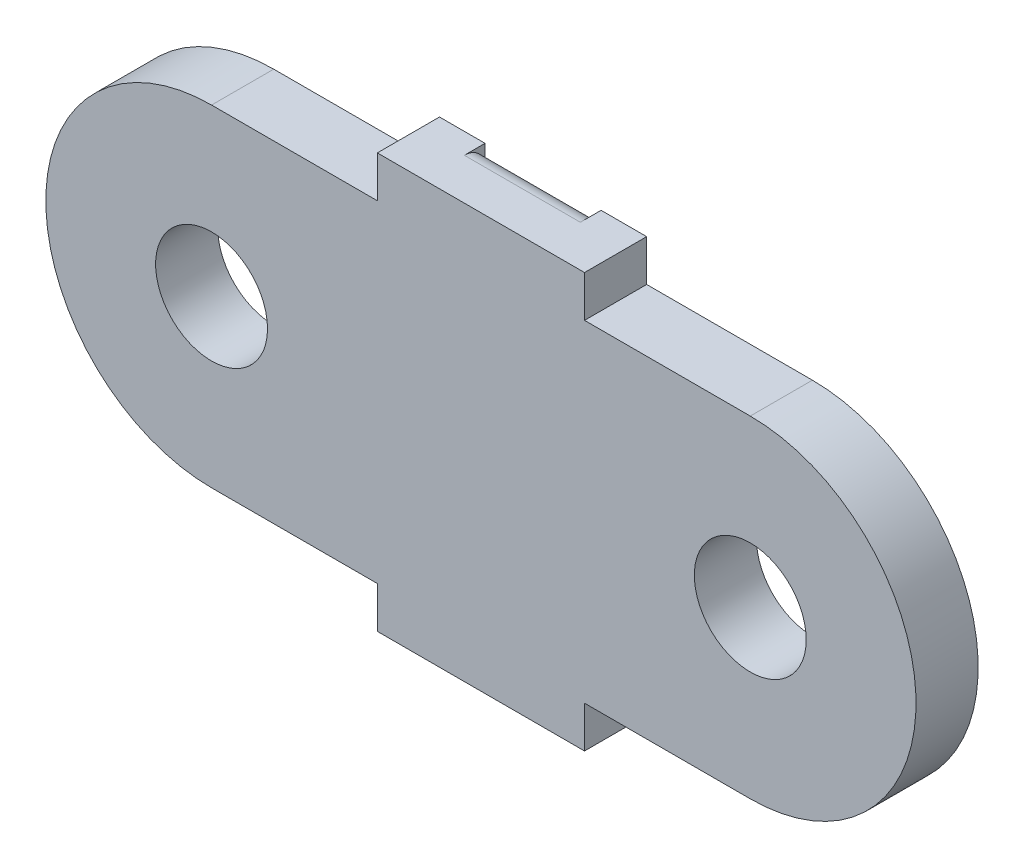
ISO-10303-21;
HEADER;
FILE_DESCRIPTION(('STEP AP214'),'2;1');
FILE_NAME('part.step','',(''),(''),'','','');
FILE_SCHEMA(('AUTOMOTIVE_DESIGN { 1 0 10303 214 1 1 1 1 }'));
ENDSEC;
DATA;
#1=APPLICATION_CONTEXT('core data for automotive mechanical design processes');
#2=APPLICATION_PROTOCOL_DEFINITION('international standard','automotive_design',2000,#1);
#3=PRODUCT_CONTEXT('',#1,'mechanical');
#4=PRODUCT('Part','Part','',(#3));
#5=PRODUCT_RELATED_PRODUCT_CATEGORY('part','',(#4));
#6=PRODUCT_DEFINITION_FORMATION('','',#4);
#7=PRODUCT_DEFINITION_CONTEXT('part definition',#1,'design');
#8=PRODUCT_DEFINITION('design','',#6,#7);
#9=PRODUCT_DEFINITION_SHAPE('','',#8);
#10=(LENGTH_UNIT() NAMED_UNIT(*) SI_UNIT(.MILLI.,.METRE.));
#11=(NAMED_UNIT(*) PLANE_ANGLE_UNIT() SI_UNIT($,.RADIAN.));
#12=(NAMED_UNIT(*) SI_UNIT($,.STERADIAN.) SOLID_ANGLE_UNIT());
#13=UNCERTAINTY_MEASURE_WITH_UNIT(LENGTH_MEASURE(1.E-05),#10,'distance_accuracy_value','');
#14=(GEOMETRIC_REPRESENTATION_CONTEXT(3) GLOBAL_UNCERTAINTY_ASSIGNED_CONTEXT((#13)) GLOBAL_UNIT_ASSIGNED_CONTEXT((#10,
#11,#12)) REPRESENTATION_CONTEXT('',''));
#15=CARTESIAN_POINT('',(0.,0.,0.));
#16=DIRECTION('',(0.,0.,1.));
#17=DIRECTION('',(1.,0.,0.));
#18=AXIS2_PLACEMENT_3D('',#15,#16,#17);
#19=CARTESIAN_POINT('',(-6.5,0.,0.));
#20=DIRECTION('',(0.,0.,-1.));
#21=DIRECTION('',(-1.,0.,0.));
#22=AXIS2_PLACEMENT_3D('',#19,#20,#21);
#23=CYLINDRICAL_SURFACE('',#22,4.);
#24=DIRECTION('',(0.,0.,-1.));
#25=VECTOR('',#24,1.);
#26=CARTESIAN_POINT('',(-6.5,4.,1.5));
#27=LINE('',#26,#25);
#28=CARTESIAN_POINT('',(-6.5,4.,0.));
#29=VERTEX_POINT('',#28);
#30=CARTESIAN_POINT('',(-6.5,4.,1.5));
#31=VERTEX_POINT('',#30);
#32=EDGE_CURVE('E258',#29,#31,#27,.F.);
#33=ORIENTED_EDGE('',*,*,#32,.F.);
#34=CARTESIAN_POINT('',(-6.5,0.,0.));
#35=DIRECTION('',(0.,0.,1.));
#36=DIRECTION('',(1.,0.,0.));
#37=AXIS2_PLACEMENT_3D('',#34,#35,#36);
#38=CIRCLE('',#37,4.);
#39=CARTESIAN_POINT('',(-6.5,-4.,0.));
#40=VERTEX_POINT('',#39);
#41=EDGE_CURVE('E264',#40,#29,#38,.F.);
#42=ORIENTED_EDGE('',*,*,#41,.F.);
#43=DIRECTION('',(0.,0.,1.));
#44=VECTOR('',#43,1.);
#45=CARTESIAN_POINT('',(-6.5,-4.,0.));
#46=LINE('',#45,#44);
#47=CARTESIAN_POINT('',(-6.5,-4.,1.5));
#48=VERTEX_POINT('',#47);
#49=EDGE_CURVE('E261',#48,#40,#46,.F.);
#50=ORIENTED_EDGE('',*,*,#49,.F.);
#51=CARTESIAN_POINT('',(-6.5,0.,1.5));
#52=DIRECTION('',(0.,0.,1.));
#53=DIRECTION('',(1.,0.,0.));
#54=AXIS2_PLACEMENT_3D('',#51,#52,#53);
#55=CIRCLE('',#54,4.);
#56=EDGE_CURVE('E266',#31,#48,#55,.T.);
#57=ORIENTED_EDGE('',*,*,#56,.F.);
#58=EDGE_LOOP('',(#33,#42,#50,#57));
#59=FACE_BOUND('',#58,.T.);
#60=ADVANCED_FACE('F39',(#59),#23,.T.);
#61=CARTESIAN_POINT('',(6.5,0.,1.5));
#62=DIRECTION('',(0.,0.,-1.));
#63=DIRECTION('',(-1.,0.,0.));
#64=AXIS2_PLACEMENT_3D('',#61,#62,#63);
#65=CYLINDRICAL_SURFACE('',#64,4.);
#66=DIRECTION('',(0.,0.,-1.));
#67=VECTOR('',#66,1.);
#68=CARTESIAN_POINT('',(6.5,4.,1.5));
#69=LINE('',#68,#67);
#70=CARTESIAN_POINT('',(6.5,4.,1.5));
#71=VERTEX_POINT('',#70);
#72=CARTESIAN_POINT('',(6.5,4.,0.));
#73=VERTEX_POINT('',#72);
#74=EDGE_CURVE('E174',#71,#73,#69,.T.);
#75=ORIENTED_EDGE('',*,*,#74,.F.);
#76=CARTESIAN_POINT('',(6.5,0.,1.5));
#77=DIRECTION('',(0.,0.,1.));
#78=DIRECTION('',(1.,0.,0.));
#79=AXIS2_PLACEMENT_3D('',#76,#77,#78);
#80=CIRCLE('',#79,4.);
#81=CARTESIAN_POINT('',(6.5,-4.,1.5));
#82=VERTEX_POINT('',#81);
#83=EDGE_CURVE('E185',#82,#71,#80,.T.);
#84=ORIENTED_EDGE('',*,*,#83,.F.);
#85=DIRECTION('',(0.,0.,1.));
#86=VECTOR('',#85,1.);
#87=CARTESIAN_POINT('',(6.5,-4.,1.5));
#88=LINE('',#87,#86);
#89=CARTESIAN_POINT('',(6.5,-4.,0.));
#90=VERTEX_POINT('',#89);
#91=EDGE_CURVE('E252',#90,#82,#88,.T.);
#92=ORIENTED_EDGE('',*,*,#91,.F.);
#93=CARTESIAN_POINT('',(6.5,0.,0.));
#94=DIRECTION('',(0.,0.,1.));
#95=DIRECTION('',(1.,0.,0.));
#96=AXIS2_PLACEMENT_3D('',#93,#94,#95);
#97=CIRCLE('',#96,4.);
#98=EDGE_CURVE('E256',#73,#90,#97,.F.);
#99=ORIENTED_EDGE('',*,*,#98,.F.);
#100=EDGE_LOOP('',(#75,#84,#92,#99));
#101=FACE_BOUND('',#100,.T.);
#102=ADVANCED_FACE('F333',(#101),#65,.T.);
#103=CARTESIAN_POINT('',(0.,4.,1.5));
#104=DIRECTION('',(0.,1.,0.));
#105=DIRECTION('',(0.,0.,1.));
#106=AXIS2_PLACEMENT_3D('',#103,#104,#105);
#107=PLANE('',#106);
#108=DIRECTION('',(1.,0.,0.));
#109=VECTOR('',#108,1.);
#110=CARTESIAN_POINT('',(0.,4.,1.5));
#111=LINE('',#110,#109);
#112=CARTESIAN_POINT('',(2.5,4.,1.5));
#113=VERTEX_POINT('',#112);
#114=EDGE_CURVE('E167',#113,#71,#111,.T.);
#115=ORIENTED_EDGE('',*,*,#114,.T.);
#116=ORIENTED_EDGE('',*,*,#74,.T.);
#117=DIRECTION('',(1.,0.,0.));
#118=VECTOR('',#117,1.);
#119=CARTESIAN_POINT('',(0.,4.,0.));
#120=LINE('',#119,#118);
#121=CARTESIAN_POINT('',(2.5,4.,0.));
#122=VERTEX_POINT('',#121);
#123=EDGE_CURVE('E169',#122,#73,#120,.T.);
#124=ORIENTED_EDGE('',*,*,#123,.F.);
#125=DIRECTION('',(0.,0.,-1.));
#126=VECTOR('',#125,1.);
#127=CARTESIAN_POINT('',(2.5,4.,1.5));
#128=LINE('',#127,#126);
#129=EDGE_CURVE('E163',#113,#122,#128,.T.);
#130=ORIENTED_EDGE('',*,*,#129,.F.);
#131=EDGE_LOOP('',(#115,#116,#124,#130));
#132=FACE_BOUND('',#131,.T.);
#133=ADVANCED_FACE('F165',(#132),#107,.T.);
#134=CARTESIAN_POINT('',(2.5,0.,1.5));
#135=DIRECTION('',(1.,0.,0.));
#136=DIRECTION('',(0.,1.,0.));
#137=AXIS2_PLACEMENT_3D('',#134,#135,#136);
#138=PLANE('',#137);
#139=DIRECTION('',(0.,-1.,0.));
#140=VECTOR('',#139,1.);
#141=CARTESIAN_POINT('',(2.5,0.,0.));
#142=LINE('',#141,#140);
#143=CARTESIAN_POINT('',(2.5,5.,0.));
#144=VERTEX_POINT('',#143);
#145=EDGE_CURVE('E214',#144,#122,#142,.T.);
#146=ORIENTED_EDGE('',*,*,#145,.F.);
#147=DIRECTION('',(0.,0.,-1.));
#148=VECTOR('',#147,1.);
#149=CARTESIAN_POINT('',(2.5,5.,1.5));
#150=LINE('',#149,#148);
#151=CARTESIAN_POINT('',(2.5,5.,1.5));
#152=VERTEX_POINT('',#151);
#153=EDGE_CURVE('E175',#152,#144,#150,.T.);
#154=ORIENTED_EDGE('',*,*,#153,.F.);
#155=DIRECTION('',(0.,-1.,0.));
#156=VECTOR('',#155,1.);
#157=CARTESIAN_POINT('',(2.5,0.,1.5));
#158=LINE('',#157,#156);
#159=EDGE_CURVE('E182',#152,#113,#158,.T.);
#160=ORIENTED_EDGE('',*,*,#159,.T.);
#161=ORIENTED_EDGE('',*,*,#129,.T.);
#162=EDGE_LOOP('',(#146,#154,#160,#161));
#163=FACE_BOUND('',#162,.T.);
#164=ADVANCED_FACE('F189',(#163),#138,.T.);
#165=CARTESIAN_POINT('',(0.,5.,1.5));
#166=DIRECTION('',(0.,1.,0.));
#167=DIRECTION('',(0.,0.,1.));
#168=AXIS2_PLACEMENT_3D('',#165,#166,#167);
#169=PLANE('',#168);
#170=DIRECTION('',(1.,0.,0.));
#171=VECTOR('',#170,1.);
#172=CARTESIAN_POINT('',(0.,5.,0.));
#173=LINE('',#172,#171);
#174=CARTESIAN_POINT('',(1.4,5.,0.));
#175=VERTEX_POINT('',#174);
#176=EDGE_CURVE('E217',#175,#144,#173,.T.);
#177=ORIENTED_EDGE('',*,*,#176,.F.);
#178=DIRECTION('',(0.,0.,1.));
#179=VECTOR('',#178,1.);
#180=CARTESIAN_POINT('',(1.4,5.,1.5));
#181=LINE('',#180,#179);
#182=CARTESIAN_POINT('',(1.4,5.,0.5));
#183=VERTEX_POINT('',#182);
#184=EDGE_CURVE('E11',#175,#183,#181,.T.);
#185=ORIENTED_EDGE('',*,*,#184,.T.);
#186=DIRECTION('',(1.,0.,0.));
#187=VECTOR('',#186,1.);
#188=CARTESIAN_POINT('',(-2.5,5.,0.5));
#189=LINE('',#188,#187);
#190=CARTESIAN_POINT('',(-1.4,5.,0.5));
#191=VERTEX_POINT('',#190);
#192=EDGE_CURVE('E48',#183,#191,#189,.F.);
#193=ORIENTED_EDGE('',*,*,#192,.T.);
#194=DIRECTION('',(0.,0.,-1.));
#195=VECTOR('',#194,1.);
#196=CARTESIAN_POINT('',(-1.4,5.,1.5));
#197=LINE('',#196,#195);
#198=CARTESIAN_POINT('',(-1.4,5.,0.));
#199=VERTEX_POINT('',#198);
#200=EDGE_CURVE('E288',#191,#199,#197,.T.);
#201=ORIENTED_EDGE('',*,*,#200,.T.);
#202=CARTESIAN_POINT('',(-2.5,5.,0.));
#203=VERTEX_POINT('',#202);
#204=EDGE_CURVE('E219',#203,#199,#173,.T.);
#205=ORIENTED_EDGE('',*,*,#204,.F.);
#206=DIRECTION('',(0.,0.,-1.));
#207=VECTOR('',#206,1.);
#208=CARTESIAN_POINT('',(-2.5,5.,1.5));
#209=LINE('',#208,#207);
#210=CARTESIAN_POINT('',(-2.5,5.,1.5));
#211=VERTEX_POINT('',#210);
#212=EDGE_CURVE('E248',#211,#203,#209,.T.);
#213=ORIENTED_EDGE('',*,*,#212,.F.);
#214=DIRECTION('',(1.,0.,0.));
#215=VECTOR('',#214,1.);
#216=CARTESIAN_POINT('',(0.,5.,1.5));
#217=LINE('',#216,#215);
#218=EDGE_CURVE('E191',#211,#152,#217,.T.);
#219=ORIENTED_EDGE('',*,*,#218,.T.);
#220=ORIENTED_EDGE('',*,*,#153,.T.);
#221=EDGE_LOOP('',(#177,#185,#193,#201,#205,#213,#219,#220));
#222=FACE_BOUND('',#221,.T.);
#223=ADVANCED_FACE('F370',(#222),#169,.T.);
#224=CARTESIAN_POINT('',(-2.5,0.,1.5));
#225=DIRECTION('',(1.,0.,0.));
#226=DIRECTION('',(0.,1.,0.));
#227=AXIS2_PLACEMENT_3D('',#224,#225,#226);
#228=PLANE('',#227);
#229=DIRECTION('',(0.,-1.,0.));
#230=VECTOR('',#229,1.);
#231=CARTESIAN_POINT('',(-2.5,0.,0.));
#232=LINE('',#231,#230);
#233=CARTESIAN_POINT('',(-2.5,4.,0.));
#234=VERTEX_POINT('',#233);
#235=EDGE_CURVE('E222',#203,#234,#232,.T.);
#236=ORIENTED_EDGE('',*,*,#235,.T.);
#237=DIRECTION('',(0.,0.,-1.));
#238=VECTOR('',#237,1.);
#239=CARTESIAN_POINT('',(-2.5,4.,1.5));
#240=LINE('',#239,#238);
#241=CARTESIAN_POINT('',(-2.5,4.,1.5));
#242=VERTEX_POINT('',#241);
#243=EDGE_CURVE('E245',#242,#234,#240,.T.);
#244=ORIENTED_EDGE('',*,*,#243,.F.);
#245=DIRECTION('',(0.,-1.,0.));
#246=VECTOR('',#245,1.);
#247=CARTESIAN_POINT('',(-2.5,0.,1.5));
#248=LINE('',#247,#246);
#249=EDGE_CURVE('E194',#211,#242,#248,.T.);
#250=ORIENTED_EDGE('',*,*,#249,.F.);
#251=ORIENTED_EDGE('',*,*,#212,.T.);
#252=EDGE_LOOP('',(#236,#244,#250,#251));
#253=FACE_BOUND('',#252,.T.);
#254=ADVANCED_FACE('F375',(#253),#228,.F.);
#255=CARTESIAN_POINT('',(0.,4.,1.5));
#256=DIRECTION('',(0.,-1.,0.));
#257=DIRECTION('',(0.,0.,-1.));
#258=AXIS2_PLACEMENT_3D('',#255,#256,#257);
#259=PLANE('',#258);
#260=DIRECTION('',(-1.,0.,0.));
#261=VECTOR('',#260,1.);
#262=CARTESIAN_POINT('',(0.,4.,0.));
#263=LINE('',#262,#261);
#264=EDGE_CURVE('E224',#234,#29,#263,.T.);
#265=ORIENTED_EDGE('',*,*,#264,.T.);
#266=ORIENTED_EDGE('',*,*,#32,.T.);
#267=DIRECTION('',(-1.,0.,0.));
#268=VECTOR('',#267,1.);
#269=CARTESIAN_POINT('',(0.,4.,1.5));
#270=LINE('',#269,#268);
#271=EDGE_CURVE('E380',#242,#31,#270,.T.);
#272=ORIENTED_EDGE('',*,*,#271,.F.);
#273=ORIENTED_EDGE('',*,*,#243,.T.);
#274=EDGE_LOOP('',(#265,#266,#272,#273));
#275=FACE_BOUND('',#274,.T.);
#276=ADVANCED_FACE('F379',(#275),#259,.F.);
#277=CARTESIAN_POINT('',(0.,-4.,1.5));
#278=DIRECTION('',(0.,-1.,0.));
#279=DIRECTION('',(0.,0.,-1.));
#280=AXIS2_PLACEMENT_3D('',#277,#278,#279);
#281=PLANE('',#280);
#282=DIRECTION('',(-1.,0.,0.));
#283=VECTOR('',#282,1.);
#284=CARTESIAN_POINT('',(0.,-4.,1.5));
#285=LINE('',#284,#283);
#286=CARTESIAN_POINT('',(-2.5,-4.,1.5));
#287=VERTEX_POINT('',#286);
#288=EDGE_CURVE('E208',#287,#48,#285,.T.);
#289=ORIENTED_EDGE('',*,*,#288,.T.);
#290=ORIENTED_EDGE('',*,*,#49,.T.);
#291=DIRECTION('',(-1.,0.,0.));
#292=VECTOR('',#291,1.);
#293=CARTESIAN_POINT('',(0.,-4.,0.));
#294=LINE('',#293,#292);
#295=CARTESIAN_POINT('',(-2.5,-4.,0.));
#296=VERTEX_POINT('',#295);
#297=EDGE_CURVE('E228',#296,#40,#294,.T.);
#298=ORIENTED_EDGE('',*,*,#297,.F.);
#299=DIRECTION('',(0.,0.,-1.));
#300=VECTOR('',#299,1.);
#301=CARTESIAN_POINT('',(-2.5,-4.,1.5));
#302=LINE('',#301,#300);
#303=EDGE_CURVE('E243',#287,#296,#302,.T.);
#304=ORIENTED_EDGE('',*,*,#303,.F.);
#305=EDGE_LOOP('',(#289,#290,#298,#304));
#306=FACE_BOUND('',#305,.T.);
#307=ADVANCED_FACE('F408',(#306),#281,.T.);
#308=CARTESIAN_POINT('',(-2.5,-5.,0.));
#309=VERTEX_POINT('',#308);
#310=EDGE_CURVE('E225',#296,#309,#232,.T.);
#311=ORIENTED_EDGE('',*,*,#310,.T.);
#312=DIRECTION('',(0.,0.,-1.));
#313=VECTOR('',#312,1.);
#314=CARTESIAN_POINT('',(-2.5,-5.,1.5));
#315=LINE('',#314,#313);
#316=CARTESIAN_POINT('',(-2.5,-5.,1.5));
#317=VERTEX_POINT('',#316);
#318=EDGE_CURVE('E240',#317,#309,#315,.T.);
#319=ORIENTED_EDGE('',*,*,#318,.F.);
#320=EDGE_CURVE('E204',#287,#317,#248,.T.);
#321=ORIENTED_EDGE('',*,*,#320,.F.);
#322=ORIENTED_EDGE('',*,*,#303,.T.);
#323=EDGE_LOOP('',(#311,#319,#321,#322));
#324=FACE_BOUND('',#323,.T.);
#325=ADVANCED_FACE('F321',(#324),#228,.F.);
#326=CARTESIAN_POINT('',(0.,-5.,1.5));
#327=DIRECTION('',(0.,1.,0.));
#328=DIRECTION('',(0.,0.,1.));
#329=AXIS2_PLACEMENT_3D('',#326,#327,#328);
#330=PLANE('',#329);
#331=DIRECTION('',(1.,0.,0.));
#332=VECTOR('',#331,1.);
#333=CARTESIAN_POINT('',(0.,-5.,0.));
#334=LINE('',#333,#332);
#335=CARTESIAN_POINT('',(-1.4,-5.,0.));
#336=VERTEX_POINT('',#335);
#337=EDGE_CURVE('E231',#309,#336,#334,.T.);
#338=ORIENTED_EDGE('',*,*,#337,.T.);
#339=DIRECTION('',(0.,0.,1.));
#340=VECTOR('',#339,1.);
#341=CARTESIAN_POINT('',(-1.4,-5.,0.5));
#342=LINE('',#341,#340);
#343=CARTESIAN_POINT('',(-1.4,-5.,0.5));
#344=VERTEX_POINT('',#343);
#345=EDGE_CURVE('E272',#336,#344,#342,.T.);
#346=ORIENTED_EDGE('',*,*,#345,.T.);
#347=DIRECTION('',(1.,0.,0.));
#348=VECTOR('',#347,1.);
#349=CARTESIAN_POINT('',(0.,-5.,0.5));
#350=LINE('',#349,#348);
#351=CARTESIAN_POINT('',(1.4,-5.,0.5));
#352=VERTEX_POINT('',#351);
#353=EDGE_CURVE('E270',#344,#352,#350,.T.);
#354=ORIENTED_EDGE('',*,*,#353,.T.);
#355=DIRECTION('',(0.,0.,-1.));
#356=VECTOR('',#355,1.);
#357=CARTESIAN_POINT('',(1.4,-5.,0.5));
#358=LINE('',#357,#356);
#359=CARTESIAN_POINT('',(1.4,-5.,0.));
#360=VERTEX_POINT('',#359);
#361=EDGE_CURVE('E268',#352,#360,#358,.T.);
#362=ORIENTED_EDGE('',*,*,#361,.T.);
#363=CARTESIAN_POINT('',(2.5,-5.,0.));
#364=VERTEX_POINT('',#363);
#365=EDGE_CURVE('E234',#360,#364,#334,.T.);
#366=ORIENTED_EDGE('',*,*,#365,.T.);
#367=DIRECTION('',(0.,0.,-1.));
#368=VECTOR('',#367,1.);
#369=CARTESIAN_POINT('',(2.5,-5.,1.5));
#370=LINE('',#369,#368);
#371=CARTESIAN_POINT('',(2.5,-5.,1.5));
#372=VERTEX_POINT('',#371);
#373=EDGE_CURVE('E238',#372,#364,#370,.T.);
#374=ORIENTED_EDGE('',*,*,#373,.F.);
#375=DIRECTION('',(1.,0.,0.));
#376=VECTOR('',#375,1.);
#377=CARTESIAN_POINT('',(0.,-5.,1.5));
#378=LINE('',#377,#376);
#379=EDGE_CURVE('E198',#317,#372,#378,.T.);
#380=ORIENTED_EDGE('',*,*,#379,.F.);
#381=ORIENTED_EDGE('',*,*,#318,.T.);
#382=EDGE_LOOP('',(#338,#346,#354,#362,#366,#374,#380,#381));
#383=FACE_BOUND('',#382,.T.);
#384=ADVANCED_FACE('F312',(#383),#330,.F.);
#385=CARTESIAN_POINT('',(2.5,-4.,0.));
#386=VERTEX_POINT('',#385);
#387=EDGE_CURVE('E218',#386,#364,#142,.T.);
#388=ORIENTED_EDGE('',*,*,#387,.F.);
#389=DIRECTION('',(0.,0.,-1.));
#390=VECTOR('',#389,1.);
#391=CARTESIAN_POINT('',(2.5,-4.,1.5));
#392=LINE('',#391,#390);
#393=CARTESIAN_POINT('',(2.5,-4.,1.5));
#394=VERTEX_POINT('',#393);
#395=EDGE_CURVE('E202',#394,#386,#392,.T.);
#396=ORIENTED_EDGE('',*,*,#395,.F.);
#397=EDGE_CURVE('E193',#394,#372,#158,.T.);
#398=ORIENTED_EDGE('',*,*,#397,.T.);
#399=ORIENTED_EDGE('',*,*,#373,.T.);
#400=EDGE_LOOP('',(#388,#396,#398,#399));
#401=FACE_BOUND('',#400,.T.);
#402=ADVANCED_FACE('F386',(#401),#138,.T.);
#403=CARTESIAN_POINT('',(0.,-4.,1.5));
#404=DIRECTION('',(0.,1.,0.));
#405=DIRECTION('',(0.,0.,1.));
#406=AXIS2_PLACEMENT_3D('',#403,#404,#405);
#407=PLANE('',#406);
#408=DIRECTION('',(1.,0.,0.));
#409=VECTOR('',#408,1.);
#410=CARTESIAN_POINT('',(0.,-4.,0.));
#411=LINE('',#410,#409);
#412=EDGE_CURVE('E187',#386,#90,#411,.T.);
#413=ORIENTED_EDGE('',*,*,#412,.T.);
#414=ORIENTED_EDGE('',*,*,#91,.T.);
#415=DIRECTION('',(1.,0.,0.));
#416=VECTOR('',#415,1.);
#417=CARTESIAN_POINT('',(0.,-4.,1.5));
#418=LINE('',#417,#416);
#419=EDGE_CURVE('E197',#394,#82,#418,.T.);
#420=ORIENTED_EDGE('',*,*,#419,.F.);
#421=ORIENTED_EDGE('',*,*,#395,.T.);
#422=EDGE_LOOP('',(#413,#414,#420,#421));
#423=FACE_BOUND('',#422,.T.);
#424=ADVANCED_FACE('F385',(#423),#407,.F.);
#425=CARTESIAN_POINT('',(0.,0.,1.5));
#426=DIRECTION('',(0.,0.,1.));
#427=DIRECTION('',(1.,0.,0.));
#428=AXIS2_PLACEMENT_3D('',#425,#426,#427);
#429=PLANE('',#428);
#430=CARTESIAN_POINT('',(-6.5,0.,1.5));
#431=DIRECTION('',(0.,0.,1.));
#432=DIRECTION('',(1.,0.,0.));
#433=AXIS2_PLACEMENT_3D('',#430,#431,#432);
#434=CIRCLE('',#433,1.35);
#435=CARTESIAN_POINT('',(-5.15,0.,1.5));
#436=VERTEX_POINT('',#435);
#437=EDGE_CURVE('E295',#436,#436,#434,.T.);
#438=ORIENTED_EDGE('',*,*,#437,.F.);
#439=EDGE_LOOP('',(#438));
#440=FACE_BOUND('',#439,.T.);
#441=CARTESIAN_POINT('',(6.5,0.,1.5));
#442=DIRECTION('',(0.,0.,1.));
#443=DIRECTION('',(1.,0.,0.));
#444=AXIS2_PLACEMENT_3D('',#441,#442,#443);
#445=CIRCLE('',#444,1.35);
#446=CARTESIAN_POINT('',(7.85,0.,1.5));
#447=VERTEX_POINT('',#446);
#448=EDGE_CURVE('E582',#447,#447,#445,.T.);
#449=ORIENTED_EDGE('',*,*,#448,.F.);
#450=EDGE_LOOP('',(#449));
#451=FACE_BOUND('',#450,.T.);
#452=ORIENTED_EDGE('',*,*,#271,.T.);
#453=ORIENTED_EDGE('',*,*,#56,.T.);
#454=ORIENTED_EDGE('',*,*,#288,.F.);
#455=ORIENTED_EDGE('',*,*,#320,.T.);
#456=ORIENTED_EDGE('',*,*,#379,.T.);
#457=ORIENTED_EDGE('',*,*,#397,.F.);
#458=ORIENTED_EDGE('',*,*,#419,.T.);
#459=ORIENTED_EDGE('',*,*,#83,.T.);
#460=ORIENTED_EDGE('',*,*,#114,.F.);
#461=ORIENTED_EDGE('',*,*,#159,.F.);
#462=ORIENTED_EDGE('',*,*,#218,.F.);
#463=ORIENTED_EDGE('',*,*,#249,.T.);
#464=EDGE_LOOP('',(#452,#453,#454,#455,#456,#457,#458,#459,#460,#461,#462,#463));
#465=FACE_BOUND('',#464,.T.);
#466=ADVANCED_FACE('F180',(#440,#451,#465),#429,.T.);
#467=CARTESIAN_POINT('',(0.,0.,0.));
#468=DIRECTION('',(0.,0.,1.));
#469=DIRECTION('',(1.,0.,0.));
#470=AXIS2_PLACEMENT_3D('',#467,#468,#469);
#471=PLANE('',#470);
#472=CARTESIAN_POINT('',(-6.5,0.,0.));
#473=DIRECTION('',(0.,0.,1.));
#474=DIRECTION('',(1.,0.,0.));
#475=AXIS2_PLACEMENT_3D('',#472,#473,#474);
#476=CIRCLE('',#475,1.35);
#477=CARTESIAN_POINT('',(-5.15,0.,0.));
#478=VERTEX_POINT('',#477);
#479=EDGE_CURVE('E584',#478,#478,#476,.T.);
#480=ORIENTED_EDGE('',*,*,#479,.T.);
#481=EDGE_LOOP('',(#480));
#482=FACE_BOUND('',#481,.T.);
#483=CARTESIAN_POINT('',(6.5,0.,0.));
#484=DIRECTION('',(0.,0.,1.));
#485=DIRECTION('',(1.,0.,0.));
#486=AXIS2_PLACEMENT_3D('',#483,#484,#485);
#487=CIRCLE('',#486,1.35);
#488=CARTESIAN_POINT('',(7.85,0.,0.));
#489=VERTEX_POINT('',#488);
#490=EDGE_CURVE('E215',#489,#489,#487,.T.);
#491=ORIENTED_EDGE('',*,*,#490,.T.);
#492=EDGE_LOOP('',(#491));
#493=FACE_BOUND('',#492,.T.);
#494=ORIENTED_EDGE('',*,*,#365,.F.);
#495=DIRECTION('',(0.,1.,0.));
#496=VECTOR('',#495,1.);
#497=CARTESIAN_POINT('',(1.4,-4.5,0.));
#498=LINE('',#497,#496);
#499=CARTESIAN_POINT('',(1.4,-4.5,0.));
#500=VERTEX_POINT('',#499);
#501=EDGE_CURVE('E286',#360,#500,#498,.T.);
#502=ORIENTED_EDGE('',*,*,#501,.T.);
#503=DIRECTION('',(1.,0.,0.));
#504=VECTOR('',#503,1.);
#505=CARTESIAN_POINT('',(0.,-4.5,0.));
#506=LINE('',#505,#504);
#507=CARTESIAN_POINT('',(-1.4,-4.5,0.));
#508=VERTEX_POINT('',#507);
#509=EDGE_CURVE('E284',#500,#508,#506,.F.);
#510=ORIENTED_EDGE('',*,*,#509,.T.);
#511=DIRECTION('',(0.,-1.,0.));
#512=VECTOR('',#511,1.);
#513=CARTESIAN_POINT('',(-1.4,-4.5,0.));
#514=LINE('',#513,#512);
#515=EDGE_CURVE('E282',#508,#336,#514,.T.);
#516=ORIENTED_EDGE('',*,*,#515,.T.);
#517=ORIENTED_EDGE('',*,*,#337,.F.);
#518=ORIENTED_EDGE('',*,*,#310,.F.);
#519=ORIENTED_EDGE('',*,*,#297,.T.);
#520=ORIENTED_EDGE('',*,*,#41,.T.);
#521=ORIENTED_EDGE('',*,*,#264,.F.);
#522=ORIENTED_EDGE('',*,*,#235,.F.);
#523=ORIENTED_EDGE('',*,*,#204,.T.);
#524=DIRECTION('',(0.,-1.,0.));
#525=VECTOR('',#524,1.);
#526=CARTESIAN_POINT('',(-1.4,4.5,0.));
#527=LINE('',#526,#525);
#528=CARTESIAN_POINT('',(-1.4,4.5,0.));
#529=VERTEX_POINT('',#528);
#530=EDGE_CURVE('E279',#199,#529,#527,.T.);
#531=ORIENTED_EDGE('',*,*,#530,.T.);
#532=DIRECTION('',(1.,0.,0.));
#533=VECTOR('',#532,1.);
#534=CARTESIAN_POINT('',(2.5,4.5,0.));
#535=LINE('',#534,#533);
#536=CARTESIAN_POINT('',(1.4,4.5,0.));
#537=VERTEX_POINT('',#536);
#538=EDGE_CURVE('E277',#529,#537,#535,.T.);
#539=ORIENTED_EDGE('',*,*,#538,.T.);
#540=DIRECTION('',(0.,1.,0.));
#541=VECTOR('',#540,1.);
#542=CARTESIAN_POINT('',(1.4,4.5,0.));
#543=LINE('',#542,#541);
#544=EDGE_CURVE('E275',#537,#175,#543,.T.);
#545=ORIENTED_EDGE('',*,*,#544,.T.);
#546=ORIENTED_EDGE('',*,*,#176,.T.);
#547=ORIENTED_EDGE('',*,*,#145,.T.);
#548=ORIENTED_EDGE('',*,*,#123,.T.);
#549=ORIENTED_EDGE('',*,*,#98,.T.);
#550=ORIENTED_EDGE('',*,*,#412,.F.);
#551=ORIENTED_EDGE('',*,*,#387,.T.);
#552=EDGE_LOOP('',(#494,#502,#510,#516,#517,#518,#519,#520,#521,#522,#523,#531,#539,#545,#546,
#547,#548,#549,#550,#551));
#553=FACE_BOUND('',#552,.T.);
#554=ADVANCED_FACE('F315',(#482,#493,#553),#471,.F.);
#555=CARTESIAN_POINT('',(6.5,0.,1.5));
#556=DIRECTION('',(0.,0.,1.));
#557=DIRECTION('',(1.,0.,0.));
#558=AXIS2_PLACEMENT_3D('',#555,#556,#557);
#559=CYLINDRICAL_SURFACE('',#558,1.35);
#560=ORIENTED_EDGE('',*,*,#490,.F.);
#561=EDGE_LOOP('',(#560));
#562=FACE_BOUND('',#561,.T.);
#563=ORIENTED_EDGE('',*,*,#448,.T.);
#564=EDGE_LOOP('',(#563));
#565=FACE_BOUND('',#564,.T.);
#566=ADVANCED_FACE('F362',(#562,#565),#559,.F.);
#567=CARTESIAN_POINT('',(-6.5,0.,1.5));
#568=DIRECTION('',(0.,0.,1.));
#569=DIRECTION('',(1.,0.,0.));
#570=AXIS2_PLACEMENT_3D('',#567,#568,#569);
#571=CYLINDRICAL_SURFACE('',#570,1.35);
#572=ORIENTED_EDGE('',*,*,#479,.F.);
#573=EDGE_LOOP('',(#572));
#574=FACE_BOUND('',#573,.T.);
#575=ORIENTED_EDGE('',*,*,#437,.T.);
#576=EDGE_LOOP('',(#575));
#577=FACE_BOUND('',#576,.T.);
#578=ADVANCED_FACE('F357',(#574,#577),#571,.F.);
#579=CARTESIAN_POINT('',(1.4,4.5,0.5));
#580=DIRECTION('',(-1.,0.,0.));
#581=DIRECTION('',(0.,0.,1.));
#582=AXIS2_PLACEMENT_3D('',#579,#580,#581);
#583=PLANE('',#582);
#584=ORIENTED_EDGE('',*,*,#184,.F.);
#585=ORIENTED_EDGE('',*,*,#544,.F.);
#586=CARTESIAN_POINT('',(1.4,4.5,0.5));
#587=DIRECTION('',(1.,0.,0.));
#588=DIRECTION('',(0.,0.,-1.));
#589=AXIS2_PLACEMENT_3D('',#586,#587,#588);
#590=CIRCLE('',#589,0.5);
#591=EDGE_CURVE('E293',#183,#537,#590,.F.);
#592=ORIENTED_EDGE('',*,*,#591,.F.);
#593=EDGE_LOOP('',(#584,#585,#592));
#594=FACE_BOUND('',#593,.T.);
#595=ADVANCED_FACE('F354',(#594),#583,.T.);
#596=CARTESIAN_POINT('',(0.,4.5,0.5));
#597=DIRECTION('',(-1.,0.,0.));
#598=DIRECTION('',(0.,0.,1.));
#599=AXIS2_PLACEMENT_3D('',#596,#597,#598);
#600=CYLINDRICAL_SURFACE('',#599,0.5);
#601=ORIENTED_EDGE('',*,*,#591,.T.);
#602=ORIENTED_EDGE('',*,*,#538,.F.);
#603=CARTESIAN_POINT('',(-1.4,4.5,0.5));
#604=DIRECTION('',(-1.,0.,0.));
#605=DIRECTION('',(0.,0.,1.));
#606=AXIS2_PLACEMENT_3D('',#603,#604,#605);
#607=CIRCLE('',#606,0.5);
#608=EDGE_CURVE('E291',#191,#529,#607,.T.);
#609=ORIENTED_EDGE('',*,*,#608,.F.);
#610=ORIENTED_EDGE('',*,*,#192,.F.);
#611=EDGE_LOOP('',(#601,#602,#609,#610));
#612=FACE_BOUND('',#611,.T.);
#613=ADVANCED_FACE('F351',(#612),#600,.T.);
#614=CARTESIAN_POINT('',(-1.4,4.5,0.5));
#615=DIRECTION('',(1.,0.,0.));
#616=DIRECTION('',(0.,0.,-1.));
#617=AXIS2_PLACEMENT_3D('',#614,#615,#616);
#618=PLANE('',#617);
#619=ORIENTED_EDGE('',*,*,#530,.F.);
#620=ORIENTED_EDGE('',*,*,#200,.F.);
#621=ORIENTED_EDGE('',*,*,#608,.T.);
#622=EDGE_LOOP('',(#619,#620,#621));
#623=FACE_BOUND('',#622,.T.);
#624=ADVANCED_FACE('F348',(#623),#618,.T.);
#625=CARTESIAN_POINT('',(1.4,-4.5,0.5));
#626=DIRECTION('',(-1.,0.,0.));
#627=DIRECTION('',(0.,0.,1.));
#628=AXIS2_PLACEMENT_3D('',#625,#626,#627);
#629=PLANE('',#628);
#630=ORIENTED_EDGE('',*,*,#501,.F.);
#631=ORIENTED_EDGE('',*,*,#361,.F.);
#632=CARTESIAN_POINT('',(1.4,-4.5,0.5));
#633=DIRECTION('',(1.,0.,0.));
#634=DIRECTION('',(0.,0.,-1.));
#635=AXIS2_PLACEMENT_3D('',#632,#633,#634);
#636=CIRCLE('',#635,0.5);
#637=EDGE_CURVE('E43',#500,#352,#636,.F.);
#638=ORIENTED_EDGE('',*,*,#637,.F.);
#639=EDGE_LOOP('',(#630,#631,#638));
#640=FACE_BOUND('',#639,.T.);
#641=ADVANCED_FACE('F41',(#640),#629,.T.);
#642=CARTESIAN_POINT('',(0.,-4.5,0.5));
#643=DIRECTION('',(1.,0.,0.));
#644=DIRECTION('',(0.,0.,-1.));
#645=AXIS2_PLACEMENT_3D('',#642,#643,#644);
#646=CYLINDRICAL_SURFACE('',#645,0.5);
#647=ORIENTED_EDGE('',*,*,#637,.T.);
#648=ORIENTED_EDGE('',*,*,#353,.F.);
#649=CARTESIAN_POINT('',(-1.4,-4.5,0.5));
#650=DIRECTION('',(-1.,0.,0.));
#651=DIRECTION('',(0.,0.,1.));
#652=AXIS2_PLACEMENT_3D('',#649,#650,#651);
#653=CIRCLE('',#652,0.5);
#654=EDGE_CURVE('E296',#508,#344,#653,.T.);
#655=ORIENTED_EDGE('',*,*,#654,.F.);
#656=ORIENTED_EDGE('',*,*,#509,.F.);
#657=EDGE_LOOP('',(#647,#648,#655,#656));
#658=FACE_BOUND('',#657,.T.);
#659=ADVANCED_FACE('F306',(#658),#646,.T.);
#660=CARTESIAN_POINT('',(-1.4,-4.5,0.5));
#661=DIRECTION('',(1.,0.,0.));
#662=DIRECTION('',(0.,0.,-1.));
#663=AXIS2_PLACEMENT_3D('',#660,#661,#662);
#664=PLANE('',#663);
#665=ORIENTED_EDGE('',*,*,#345,.F.);
#666=ORIENTED_EDGE('',*,*,#515,.F.);
#667=ORIENTED_EDGE('',*,*,#654,.T.);
#668=EDGE_LOOP('',(#665,#666,#667));
#669=FACE_BOUND('',#668,.T.);
#670=ADVANCED_FACE('F325',(#669),#664,.T.);
#671=CLOSED_SHELL('',(#60,#102,#133,#164,#223,#254,#276,#307,#325,#384,#402,#424,#466,#554,#566,
#578,#595,#613,#624,#641,#659,#670));
#672=MANIFOLD_SOLID_BREP('B2',#671);
#673=ADVANCED_BREP_SHAPE_REPRESENTATION('',(#18,#672),#14);
#674=SHAPE_DEFINITION_REPRESENTATION(#9,#673);
ENDSEC;
END-ISO-10303-21;
